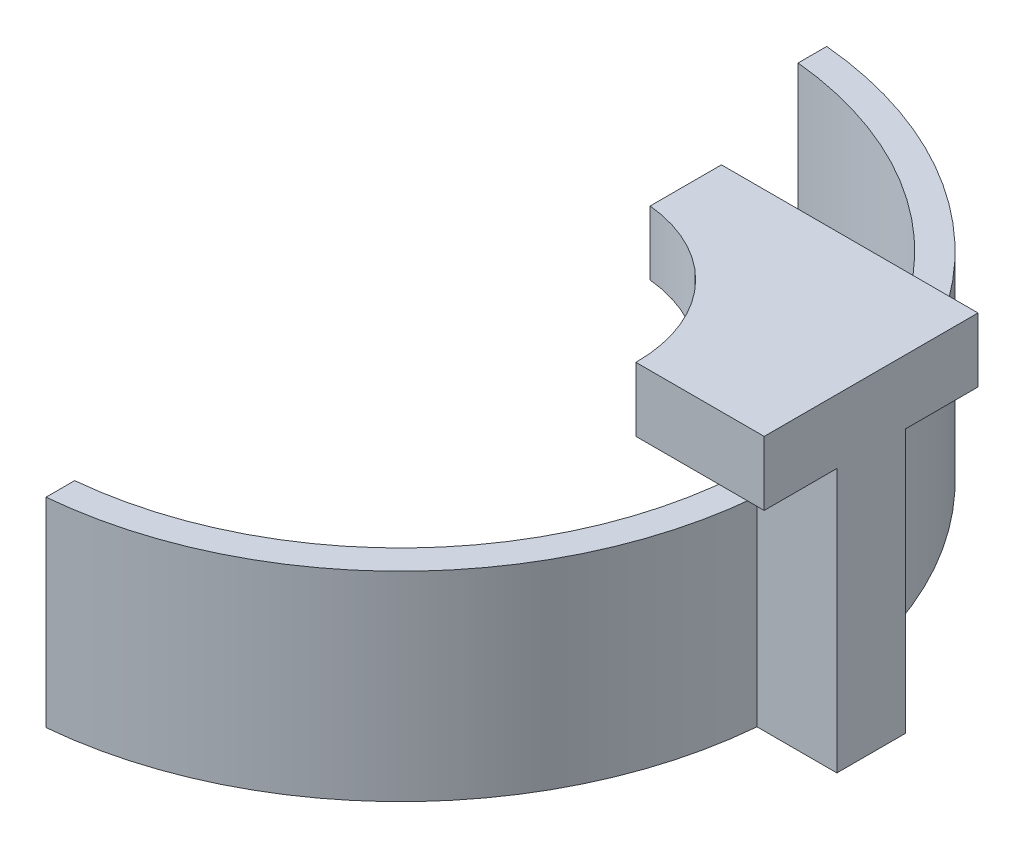
ISO-10303-21;
HEADER;
FILE_DESCRIPTION(('STEP AP214'),'2;1');
FILE_NAME('part.step','',(''),(''),'','','');
FILE_SCHEMA(('AUTOMOTIVE_DESIGN { 1 0 10303 214 1 1 1 1 }'));
ENDSEC;
DATA;
#1=APPLICATION_CONTEXT('core data for automotive mechanical design processes');
#2=APPLICATION_PROTOCOL_DEFINITION('international standard','automotive_design',2000,#1);
#3=PRODUCT_CONTEXT('',#1,'mechanical');
#4=PRODUCT('Part','Part','',(#3));
#5=PRODUCT_RELATED_PRODUCT_CATEGORY('part','',(#4));
#6=PRODUCT_DEFINITION_FORMATION('','',#4);
#7=PRODUCT_DEFINITION_CONTEXT('part definition',#1,'design');
#8=PRODUCT_DEFINITION('design','',#6,#7);
#9=PRODUCT_DEFINITION_SHAPE('','',#8);
#10=(LENGTH_UNIT() NAMED_UNIT(*) SI_UNIT(.MILLI.,.METRE.));
#11=(NAMED_UNIT(*) PLANE_ANGLE_UNIT() SI_UNIT($,.RADIAN.));
#12=(NAMED_UNIT(*) SI_UNIT($,.STERADIAN.) SOLID_ANGLE_UNIT());
#13=UNCERTAINTY_MEASURE_WITH_UNIT(LENGTH_MEASURE(1.E-05),#10,'distance_accuracy_value','');
#14=(GEOMETRIC_REPRESENTATION_CONTEXT(3) GLOBAL_UNCERTAINTY_ASSIGNED_CONTEXT((#13)) GLOBAL_UNIT_ASSIGNED_CONTEXT((#10,
#11,#12)) REPRESENTATION_CONTEXT('',''));
#15=CARTESIAN_POINT('',(0.,0.,0.));
#16=DIRECTION('',(0.,0.,1.));
#17=DIRECTION('',(1.,0.,0.));
#18=AXIS2_PLACEMENT_3D('',#15,#16,#17);
#19=CARTESIAN_POINT('',(0.,12.,0.));
#20=DIRECTION('',(0.,-1.,0.));
#21=DIRECTION('',(0.,0.,-1.));
#22=AXIS2_PLACEMENT_3D('',#19,#20,#21);
#23=CYLINDRICAL_SURFACE('',#22,27.5);
#24=DIRECTION('',(0.,-1.,0.));
#25=VECTOR('',#24,1.);
#26=CARTESIAN_POINT('',(27.3950725496393,12.,-2.4));
#27=LINE('',#26,#25);
#28=CARTESIAN_POINT('',(27.3950725496393,-2.,-2.4));
#29=VERTEX_POINT('',#28);
#30=CARTESIAN_POINT('',(27.3950725496393,12.,-2.4));
#31=VERTEX_POINT('',#30);
#32=EDGE_CURVE('E257',#29,#31,#27,.F.);
#33=ORIENTED_EDGE('',*,*,#32,.F.);
#34=CARTESIAN_POINT('',(0.,-2.,0.));
#35=DIRECTION('',(0.,1.,0.));
#36=DIRECTION('',(0.,0.,-1.));
#37=AXIS2_PLACEMENT_3D('',#34,#35,#36);
#38=CIRCLE('',#37,27.5);
#39=CARTESIAN_POINT('',(2.5,-2.,-27.3861278752583));
#40=VERTEX_POINT('',#39);
#41=EDGE_CURVE('E266',#29,#40,#38,.T.);
#42=ORIENTED_EDGE('',*,*,#41,.T.);
#43=DIRECTION('',(0.,1.,0.));
#44=VECTOR('',#43,1.);
#45=CARTESIAN_POINT('',(2.5,-2.,-27.3861278752583));
#46=LINE('',#45,#44);
#47=CARTESIAN_POINT('',(2.5,0.,-27.3861278752583));
#48=VERTEX_POINT('',#47);
#49=EDGE_CURVE('E278',#40,#48,#46,.T.);
#50=ORIENTED_EDGE('',*,*,#49,.T.);
#51=DIRECTION('',(0.,-1.,0.));
#52=VECTOR('',#51,1.);
#53=CARTESIAN_POINT('',(2.5,12.,-27.3861278752583));
#54=LINE('',#53,#52);
#55=CARTESIAN_POINT('',(2.5,12.,-27.3861278752583));
#56=VERTEX_POINT('',#55);
#57=EDGE_CURVE('E47',#56,#48,#54,.T.);
#58=ORIENTED_EDGE('',*,*,#57,.F.);
#59=CARTESIAN_POINT('',(0.,12.,0.));
#60=DIRECTION('',(0.,1.,0.));
#61=DIRECTION('',(0.,0.,1.));
#62=AXIS2_PLACEMENT_3D('',#59,#60,#61);
#63=CIRCLE('',#62,27.5);
#64=EDGE_CURVE('E308',#31,#56,#63,.T.);
#65=ORIENTED_EDGE('',*,*,#64,.F.);
#66=EDGE_LOOP('',(#33,#42,#50,#58,#65));
#67=FACE_BOUND('',#66,.T.);
#68=ADVANCED_FACE('F39',(#67),#23,.T.);
#69=DIRECTION('',(0.,-1.,0.));
#70=VECTOR('',#69,1.);
#71=CARTESIAN_POINT('',(27.3950725496393,12.,2.4));
#72=LINE('',#71,#70);
#73=CARTESIAN_POINT('',(27.3950725496393,12.,2.4));
#74=VERTEX_POINT('',#73);
#75=CARTESIAN_POINT('',(27.3950725496393,-2.,2.4));
#76=VERTEX_POINT('',#75);
#77=EDGE_CURVE('E246',#74,#76,#72,.T.);
#78=ORIENTED_EDGE('',*,*,#77,.F.);
#79=CARTESIAN_POINT('',(2.5,12.,27.3861278752583));
#80=VERTEX_POINT('',#79);
#81=EDGE_CURVE('E303',#80,#74,#63,.T.);
#82=ORIENTED_EDGE('',*,*,#81,.F.);
#83=DIRECTION('',(0.,-1.,0.));
#84=VECTOR('',#83,1.);
#85=CARTESIAN_POINT('',(2.5,12.,27.3861278752583));
#86=LINE('',#85,#84);
#87=CARTESIAN_POINT('',(2.5,0.,27.3861278752583));
#88=VERTEX_POINT('',#87);
#89=EDGE_CURVE('E317',#80,#88,#86,.T.);
#90=ORIENTED_EDGE('',*,*,#89,.T.);
#91=DIRECTION('',(0.,1.,0.));
#92=VECTOR('',#91,1.);
#93=CARTESIAN_POINT('',(2.5,-2.,27.3861278752583));
#94=LINE('',#93,#92);
#95=CARTESIAN_POINT('',(2.5,-2.,27.3861278752583));
#96=VERTEX_POINT('',#95);
#97=EDGE_CURVE('E290',#96,#88,#94,.T.);
#98=ORIENTED_EDGE('',*,*,#97,.F.);
#99=EDGE_CURVE('E261',#96,#76,#38,.T.);
#100=ORIENTED_EDGE('',*,*,#99,.T.);
#101=EDGE_LOOP('',(#78,#82,#90,#98,#100));
#102=FACE_BOUND('',#101,.T.);
#103=ADVANCED_FACE('F409',(#102),#23,.T.);
#104=CARTESIAN_POINT('',(0.,12.,0.));
#105=DIRECTION('',(0.,1.,0.));
#106=DIRECTION('',(0.,0.,1.));
#107=AXIS2_PLACEMENT_3D('',#104,#105,#106);
#108=PLANE('',#107);
#109=DIRECTION('',(0.,0.,-1.));
#110=VECTOR('',#109,1.);
#111=CARTESIAN_POINT('',(27.,12.,0.));
#112=LINE('',#111,#110);
#113=CARTESIAN_POINT('',(27.,12.,2.4));
#114=VERTEX_POINT('',#113);
#115=CARTESIAN_POINT('',(27.,12.,-2.4));
#116=VERTEX_POINT('',#115);
#117=EDGE_CURVE('E249',#114,#116,#112,.T.);
#118=ORIENTED_EDGE('',*,*,#117,.T.);
#119=DIRECTION('',(1.,0.,0.));
#120=VECTOR('',#119,1.);
#121=CARTESIAN_POINT('',(0.,12.,-2.4));
#122=LINE('',#121,#120);
#123=EDGE_CURVE('E253',#116,#31,#122,.T.);
#124=ORIENTED_EDGE('',*,*,#123,.T.);
#125=ORIENTED_EDGE('',*,*,#64,.T.);
#126=DIRECTION('',(0.,0.,1.));
#127=VECTOR('',#126,1.);
#128=CARTESIAN_POINT('',(2.5,12.,-27.3861278752583));
#129=LINE('',#128,#127);
#130=CARTESIAN_POINT('',(2.5,12.,-25.377155080899));
#131=VERTEX_POINT('',#130);
#132=EDGE_CURVE('E307',#56,#131,#129,.T.);
#133=ORIENTED_EDGE('',*,*,#132,.T.);
#134=CARTESIAN_POINT('',(0.,12.,0.));
#135=DIRECTION('',(0.,-1.,0.));
#136=DIRECTION('',(0.,0.,1.));
#137=AXIS2_PLACEMENT_3D('',#134,#135,#136);
#138=CIRCLE('',#137,25.5);
#139=CARTESIAN_POINT('',(2.5,12.,25.377155080899));
#140=VERTEX_POINT('',#139);
#141=EDGE_CURVE('E311',#131,#140,#138,.T.);
#142=ORIENTED_EDGE('',*,*,#141,.T.);
#143=DIRECTION('',(0.,0.,1.));
#144=VECTOR('',#143,1.);
#145=CARTESIAN_POINT('',(2.5,12.,25.377155080899));
#146=LINE('',#145,#144);
#147=EDGE_CURVE('E314',#140,#80,#146,.T.);
#148=ORIENTED_EDGE('',*,*,#147,.T.);
#149=ORIENTED_EDGE('',*,*,#81,.T.);
#150=DIRECTION('',(-1.,0.,0.));
#151=VECTOR('',#150,1.);
#152=CARTESIAN_POINT('',(0.,12.,2.4));
#153=LINE('',#152,#151);
#154=EDGE_CURVE('E242',#74,#114,#153,.T.);
#155=ORIENTED_EDGE('',*,*,#154,.T.);
#156=EDGE_LOOP('',(#118,#124,#125,#133,#142,#148,#149,#155));
#157=FACE_BOUND('',#156,.T.);
#158=ADVANCED_FACE('F369',(#157),#108,.T.);
#159=CARTESIAN_POINT('',(2.5,12.,-27.3861278752583));
#160=DIRECTION('',(1.,0.,0.));
#161=DIRECTION('',(0.,0.,-1.));
#162=AXIS2_PLACEMENT_3D('',#159,#160,#161);
#163=PLANE('',#162);
#164=DIRECTION('',(0.,0.,1.));
#165=VECTOR('',#164,1.);
#166=CARTESIAN_POINT('',(2.5,0.,-27.3861278752583));
#167=LINE('',#166,#165);
#168=CARTESIAN_POINT('',(2.5,0.,-25.377155080899));
#169=VERTEX_POINT('',#168);
#170=EDGE_CURVE('E293',#48,#169,#167,.T.);
#171=ORIENTED_EDGE('',*,*,#170,.T.);
#172=DIRECTION('',(0.,-1.,0.));
#173=VECTOR('',#172,1.);
#174=CARTESIAN_POINT('',(2.5,12.,-25.377155080899));
#175=LINE('',#174,#173);
#176=EDGE_CURVE('E336',#131,#169,#175,.T.);
#177=ORIENTED_EDGE('',*,*,#176,.F.);
#178=ORIENTED_EDGE('',*,*,#132,.F.);
#179=ORIENTED_EDGE('',*,*,#57,.T.);
#180=EDGE_LOOP('',(#171,#177,#178,#179));
#181=FACE_BOUND('',#180,.T.);
#182=ADVANCED_FACE('F344',(#181),#163,.F.);
#183=CARTESIAN_POINT('',(0.,12.,0.));
#184=DIRECTION('',(0.,-1.,0.));
#185=DIRECTION('',(0.,0.,-1.));
#186=AXIS2_PLACEMENT_3D('',#183,#184,#185);
#187=CYLINDRICAL_SURFACE('',#186,25.5);
#188=CARTESIAN_POINT('',(0.,0.,0.));
#189=DIRECTION('',(0.,-1.,0.));
#190=DIRECTION('',(0.,0.,1.));
#191=AXIS2_PLACEMENT_3D('',#188,#189,#190);
#192=CIRCLE('',#191,25.5);
#193=CARTESIAN_POINT('',(2.5,0.,25.377155080899));
#194=VERTEX_POINT('',#193);
#195=EDGE_CURVE('E321',#169,#194,#192,.T.);
#196=ORIENTED_EDGE('',*,*,#195,.T.);
#197=DIRECTION('',(0.,-1.,0.));
#198=VECTOR('',#197,1.);
#199=CARTESIAN_POINT('',(2.5,12.,25.377155080899));
#200=LINE('',#199,#198);
#201=EDGE_CURVE('E332',#140,#194,#200,.T.);
#202=ORIENTED_EDGE('',*,*,#201,.F.);
#203=ORIENTED_EDGE('',*,*,#141,.F.);
#204=ORIENTED_EDGE('',*,*,#176,.T.);
#205=EDGE_LOOP('',(#196,#202,#203,#204));
#206=FACE_BOUND('',#205,.T.);
#207=ADVANCED_FACE('F361',(#206),#187,.F.);
#208=CARTESIAN_POINT('',(2.5,12.,25.377155080899));
#209=DIRECTION('',(1.,0.,0.));
#210=DIRECTION('',(0.,0.,-1.));
#211=AXIS2_PLACEMENT_3D('',#208,#209,#210);
#212=PLANE('',#211);
#213=DIRECTION('',(0.,0.,1.));
#214=VECTOR('',#213,1.);
#215=CARTESIAN_POINT('',(2.5,0.,25.377155080899));
#216=LINE('',#215,#214);
#217=EDGE_CURVE('E325',#194,#88,#216,.T.);
#218=ORIENTED_EDGE('',*,*,#217,.T.);
#219=ORIENTED_EDGE('',*,*,#89,.F.);
#220=ORIENTED_EDGE('',*,*,#147,.F.);
#221=ORIENTED_EDGE('',*,*,#201,.T.);
#222=EDGE_LOOP('',(#218,#219,#220,#221));
#223=FACE_BOUND('',#222,.T.);
#224=ADVANCED_FACE('F365',(#223),#212,.F.);
#225=CARTESIAN_POINT('',(2.5,-2.,27.3861278752583));
#226=DIRECTION('',(-0.995859195463938,0.,0.0909090909090934));
#227=DIRECTION('',(0.0909090909090934,0.,0.995859195463938));
#228=AXIS2_PLACEMENT_3D('',#225,#226,#227);
#229=PLANE('',#228);
#230=DIRECTION('',(0.0909090909090934,0.,0.995859195463938));
#231=VECTOR('',#230,1.);
#232=CARTESIAN_POINT('',(2.5,0.,27.3861278752583));
#233=LINE('',#232,#231);
#234=CARTESIAN_POINT('',(1.86363636363634,0.,20.4151135070107));
#235=VERTEX_POINT('',#234);
#236=EDGE_CURVE('E286',#235,#88,#233,.T.);
#237=ORIENTED_EDGE('',*,*,#236,.F.);
#238=DIRECTION('',(0.,1.,0.));
#239=VECTOR('',#238,1.);
#240=CARTESIAN_POINT('',(1.86363636363634,-2.,20.4151135070107));
#241=LINE('',#240,#239);
#242=CARTESIAN_POINT('',(1.86363636363634,-2.,20.4151135070107));
#243=VERTEX_POINT('',#242);
#244=EDGE_CURVE('E294',#243,#235,#241,.T.);
#245=ORIENTED_EDGE('',*,*,#244,.F.);
#246=DIRECTION('',(0.0909090909090934,0.,0.995859195463938));
#247=VECTOR('',#246,1.);
#248=CARTESIAN_POINT('',(2.5,-2.,27.3861278752583));
#249=LINE('',#248,#247);
#250=EDGE_CURVE('E274',#243,#96,#249,.T.);
#251=ORIENTED_EDGE('',*,*,#250,.T.);
#252=ORIENTED_EDGE('',*,*,#97,.T.);
#253=EDGE_LOOP('',(#237,#245,#251,#252));
#254=FACE_BOUND('',#253,.T.);
#255=ADVANCED_FACE('F417',(#254),#229,.T.);
#256=CARTESIAN_POINT('',(0.,-2.,0.));
#257=DIRECTION('',(0.,1.,0.));
#258=DIRECTION('',(0.,0.,1.));
#259=AXIS2_PLACEMENT_3D('',#256,#257,#258);
#260=CYLINDRICAL_SURFACE('',#259,20.5);
#261=CARTESIAN_POINT('',(0.,0.,0.));
#262=DIRECTION('',(0.,-1.,0.));
#263=DIRECTION('',(0.,0.,-1.));
#264=AXIS2_PLACEMENT_3D('',#261,#262,#263);
#265=CIRCLE('',#264,20.5);
#266=CARTESIAN_POINT('',(1.86363636363636,0.,-20.4151135070107));
#267=VERTEX_POINT('',#266);
#268=EDGE_CURVE('E282',#267,#235,#265,.T.);
#269=ORIENTED_EDGE('',*,*,#268,.F.);
#270=DIRECTION('',(0.,1.,0.));
#271=VECTOR('',#270,1.);
#272=CARTESIAN_POINT('',(1.86363636363636,-2.,-20.4151135070107));
#273=LINE('',#272,#271);
#274=CARTESIAN_POINT('',(1.86363636363636,-2.,-20.4151135070107));
#275=VERTEX_POINT('',#274);
#276=EDGE_CURVE('E297',#275,#267,#273,.T.);
#277=ORIENTED_EDGE('',*,*,#276,.F.);
#278=CARTESIAN_POINT('',(0.,-2.,0.));
#279=DIRECTION('',(0.,-1.,0.));
#280=DIRECTION('',(0.,0.,-1.));
#281=AXIS2_PLACEMENT_3D('',#278,#279,#280);
#282=CIRCLE('',#281,20.5);
#283=EDGE_CURVE('E270',#275,#243,#282,.T.);
#284=ORIENTED_EDGE('',*,*,#283,.T.);
#285=ORIENTED_EDGE('',*,*,#244,.T.);
#286=EDGE_LOOP('',(#269,#277,#284,#285));
#287=FACE_BOUND('',#286,.T.);
#288=ADVANCED_FACE('F419',(#287),#260,.F.);
#289=CARTESIAN_POINT('',(2.5,-2.,-27.3861278752583));
#290=DIRECTION('',(-0.995859195463938,0.,-0.0909090909090919));
#291=DIRECTION('',(-0.0909090909090919,0.,0.995859195463938));
#292=AXIS2_PLACEMENT_3D('',#289,#290,#291);
#293=PLANE('',#292);
#294=DIRECTION('',(-0.0909090909090919,0.,0.995859195463938));
#295=VECTOR('',#294,1.);
#296=CARTESIAN_POINT('',(2.5,0.,-27.3861278752583));
#297=LINE('',#296,#295);
#298=EDGE_CURVE('E260',#48,#267,#297,.T.);
#299=ORIENTED_EDGE('',*,*,#298,.F.);
#300=ORIENTED_EDGE('',*,*,#49,.F.);
#301=DIRECTION('',(-0.0909090909090919,0.,0.995859195463938));
#302=VECTOR('',#301,1.);
#303=CARTESIAN_POINT('',(2.5,-2.,-27.3861278752583));
#304=LINE('',#303,#302);
#305=EDGE_CURVE('E265',#40,#275,#304,.T.);
#306=ORIENTED_EDGE('',*,*,#305,.T.);
#307=ORIENTED_EDGE('',*,*,#276,.T.);
#308=EDGE_LOOP('',(#299,#300,#306,#307));
#309=FACE_BOUND('',#308,.T.);
#310=ADVANCED_FACE('F354',(#309),#293,.T.);
#311=CARTESIAN_POINT('',(0.,-2.,0.));
#312=DIRECTION('',(0.,-1.,0.));
#313=DIRECTION('',(0.,0.,-1.));
#314=AXIS2_PLACEMENT_3D('',#311,#312,#313);
#315=PLANE('',#314);
#316=ORIENTED_EDGE('',*,*,#41,.F.);
#317=DIRECTION('',(-1.,0.,0.));
#318=VECTOR('',#317,1.);
#319=CARTESIAN_POINT('',(27.,-2.,-2.4));
#320=LINE('',#319,#318);
#321=CARTESIAN_POINT('',(33.,-2.,-2.4));
#322=VERTEX_POINT('',#321);
#323=EDGE_CURVE('E225',#322,#29,#320,.T.);
#324=ORIENTED_EDGE('',*,*,#323,.F.);
#325=DIRECTION('',(0.,0.,-1.));
#326=VECTOR('',#325,1.);
#327=CARTESIAN_POINT('',(33.,-2.,-2.4));
#328=LINE('',#327,#326);
#329=CARTESIAN_POINT('',(33.,-2.,2.4));
#330=VERTEX_POINT('',#329);
#331=EDGE_CURVE('E221',#330,#322,#328,.T.);
#332=ORIENTED_EDGE('',*,*,#331,.F.);
#333=DIRECTION('',(1.,0.,0.));
#334=VECTOR('',#333,1.);
#335=CARTESIAN_POINT('',(27.,-2.,2.4));
#336=LINE('',#335,#334);
#337=EDGE_CURVE('E228',#76,#330,#336,.T.);
#338=ORIENTED_EDGE('',*,*,#337,.F.);
#339=ORIENTED_EDGE('',*,*,#99,.F.);
#340=ORIENTED_EDGE('',*,*,#250,.F.);
#341=ORIENTED_EDGE('',*,*,#283,.F.);
#342=ORIENTED_EDGE('',*,*,#305,.F.);
#343=EDGE_LOOP('',(#316,#324,#332,#338,#339,#340,#341,#342));
#344=FACE_BOUND('',#343,.T.);
#345=ADVANCED_FACE('F413',(#344),#315,.T.);
#346=CARTESIAN_POINT('',(0.,0.,0.));
#347=DIRECTION('',(0.,-1.,0.));
#348=DIRECTION('',(0.,0.,-1.));
#349=AXIS2_PLACEMENT_3D('',#346,#347,#348);
#350=PLANE('',#349);
#351=ORIENTED_EDGE('',*,*,#217,.F.);
#352=ORIENTED_EDGE('',*,*,#195,.F.);
#353=ORIENTED_EDGE('',*,*,#170,.F.);
#354=ORIENTED_EDGE('',*,*,#298,.T.);
#355=ORIENTED_EDGE('',*,*,#268,.T.);
#356=ORIENTED_EDGE('',*,*,#236,.T.);
#357=EDGE_LOOP('',(#351,#352,#353,#354,#355,#356));
#358=FACE_BOUND('',#357,.T.);
#359=ADVANCED_FACE('F357',(#358),#350,.F.);
#360=CARTESIAN_POINT('',(27.,18.,-2.4));
#361=DIRECTION('',(0.,0.,1.));
#362=DIRECTION('',(1.,0.,0.));
#363=AXIS2_PLACEMENT_3D('',#360,#361,#362);
#364=PLANE('',#363);
#365=DIRECTION('',(0.,-1.,0.));
#366=VECTOR('',#365,1.);
#367=CARTESIAN_POINT('',(27.,18.,-2.4));
#368=LINE('',#367,#366);
#369=CARTESIAN_POINT('',(27.,16.5,-2.4));
#370=VERTEX_POINT('',#369);
#371=EDGE_CURVE('E236',#370,#116,#368,.T.);
#372=ORIENTED_EDGE('',*,*,#371,.F.);
#373=DIRECTION('',(1.,0.,0.));
#374=VECTOR('',#373,1.);
#375=CARTESIAN_POINT('',(27.,16.5,-2.4));
#376=LINE('',#375,#374);
#377=CARTESIAN_POINT('',(33.,16.5,-2.4));
#378=VERTEX_POINT('',#377);
#379=EDGE_CURVE('E218',#370,#378,#376,.T.);
#380=ORIENTED_EDGE('',*,*,#379,.T.);
#381=DIRECTION('',(0.,-1.,0.));
#382=VECTOR('',#381,1.);
#383=CARTESIAN_POINT('',(33.,18.,-2.4));
#384=LINE('',#383,#382);
#385=EDGE_CURVE('E239',#378,#322,#384,.T.);
#386=ORIENTED_EDGE('',*,*,#385,.T.);
#387=ORIENTED_EDGE('',*,*,#323,.T.);
#388=ORIENTED_EDGE('',*,*,#32,.T.);
#389=ORIENTED_EDGE('',*,*,#123,.F.);
#390=EDGE_LOOP('',(#372,#380,#386,#387,#388,#389));
#391=FACE_BOUND('',#390,.T.);
#392=ADVANCED_FACE('F422',(#391),#364,.F.);
#393=CARTESIAN_POINT('',(27.,18.,2.4));
#394=DIRECTION('',(0.,0.,-1.));
#395=DIRECTION('',(-1.,0.,0.));
#396=AXIS2_PLACEMENT_3D('',#393,#394,#395);
#397=PLANE('',#396);
#398=DIRECTION('',(0.,-1.,0.));
#399=VECTOR('',#398,1.);
#400=CARTESIAN_POINT('',(33.,18.,2.4));
#401=LINE('',#400,#399);
#402=CARTESIAN_POINT('',(33.,16.5,2.4));
#403=VERTEX_POINT('',#402);
#404=EDGE_CURVE('E62',#403,#330,#401,.T.);
#405=ORIENTED_EDGE('',*,*,#404,.F.);
#406=DIRECTION('',(-1.,0.,0.));
#407=VECTOR('',#406,1.);
#408=CARTESIAN_POINT('',(27.,16.5,2.4));
#409=LINE('',#408,#407);
#410=CARTESIAN_POINT('',(27.,16.5,2.4));
#411=VERTEX_POINT('',#410);
#412=EDGE_CURVE('E209',#403,#411,#409,.T.);
#413=ORIENTED_EDGE('',*,*,#412,.T.);
#414=DIRECTION('',(0.,-1.,0.));
#415=VECTOR('',#414,1.);
#416=CARTESIAN_POINT('',(27.,18.,2.4));
#417=LINE('',#416,#415);
#418=EDGE_CURVE('E233',#411,#114,#417,.T.);
#419=ORIENTED_EDGE('',*,*,#418,.T.);
#420=ORIENTED_EDGE('',*,*,#154,.F.);
#421=ORIENTED_EDGE('',*,*,#77,.T.);
#422=ORIENTED_EDGE('',*,*,#337,.T.);
#423=EDGE_LOOP('',(#405,#413,#419,#420,#421,#422));
#424=FACE_BOUND('',#423,.T.);
#425=ADVANCED_FACE('F401',(#424),#397,.F.);
#426=CARTESIAN_POINT('',(33.,18.,-2.4));
#427=DIRECTION('',(-1.,0.,0.));
#428=DIRECTION('',(0.,0.,1.));
#429=AXIS2_PLACEMENT_3D('',#426,#427,#428);
#430=PLANE('',#429);
#431=ORIENTED_EDGE('',*,*,#385,.F.);
#432=DIRECTION('',(0.,0.,-1.));
#433=VECTOR('',#432,1.);
#434=CARTESIAN_POINT('',(33.,16.5,-7.5));
#435=LINE('',#434,#433);
#436=CARTESIAN_POINT('',(33.,16.5,-7.5));
#437=VERTEX_POINT('',#436);
#438=EDGE_CURVE('E189',#378,#437,#435,.T.);
#439=ORIENTED_EDGE('',*,*,#438,.T.);
#440=DIRECTION('',(0.,1.,0.));
#441=VECTOR('',#440,1.);
#442=CARTESIAN_POINT('',(33.,16.5,-7.5));
#443=LINE('',#442,#441);
#444=CARTESIAN_POINT('',(33.,21.,-7.5));
#445=VERTEX_POINT('',#444);
#446=EDGE_CURVE('E210',#437,#445,#443,.T.);
#447=ORIENTED_EDGE('',*,*,#446,.T.);
#448=DIRECTION('',(0.,0.,-1.));
#449=VECTOR('',#448,1.);
#450=CARTESIAN_POINT('',(33.,21.,-7.5));
#451=LINE('',#450,#449);
#452=CARTESIAN_POINT('',(33.,21.,7.5));
#453=VERTEX_POINT('',#452);
#454=EDGE_CURVE('E191',#453,#445,#451,.T.);
#455=ORIENTED_EDGE('',*,*,#454,.F.);
#456=DIRECTION('',(0.,1.,0.));
#457=VECTOR('',#456,1.);
#458=CARTESIAN_POINT('',(33.,16.5,7.5));
#459=LINE('',#458,#457);
#460=CARTESIAN_POINT('',(33.,16.5,7.5));
#461=VERTEX_POINT('',#460);
#462=EDGE_CURVE('E205',#461,#453,#459,.T.);
#463=ORIENTED_EDGE('',*,*,#462,.F.);
#464=EDGE_CURVE('E195',#461,#403,#435,.T.);
#465=ORIENTED_EDGE('',*,*,#464,.T.);
#466=ORIENTED_EDGE('',*,*,#404,.T.);
#467=ORIENTED_EDGE('',*,*,#331,.T.);
#468=EDGE_LOOP('',(#431,#439,#447,#455,#463,#465,#466,#467));
#469=FACE_BOUND('',#468,.T.);
#470=ADVANCED_FACE('F378',(#469),#430,.F.);
#471=CARTESIAN_POINT('',(27.,18.,-2.4));
#472=DIRECTION('',(1.,0.,0.));
#473=DIRECTION('',(0.,0.,-1.));
#474=AXIS2_PLACEMENT_3D('',#471,#472,#473);
#475=PLANE('',#474);
#476=ORIENTED_EDGE('',*,*,#418,.F.);
#477=DIRECTION('',(0.,0.,-1.));
#478=VECTOR('',#477,1.);
#479=CARTESIAN_POINT('',(27.,16.5,-2.4));
#480=LINE('',#479,#478);
#481=EDGE_CURVE('E11',#411,#370,#480,.T.);
#482=ORIENTED_EDGE('',*,*,#481,.T.);
#483=ORIENTED_EDGE('',*,*,#371,.T.);
#484=ORIENTED_EDGE('',*,*,#117,.F.);
#485=EDGE_LOOP('',(#476,#482,#483,#484));
#486=FACE_BOUND('',#485,.T.);
#487=ADVANCED_FACE('F404',(#486),#475,.F.);
#488=CARTESIAN_POINT('',(0.,16.5,0.));
#489=DIRECTION('',(0.,-1.,0.));
#490=DIRECTION('',(0.,0.,-1.));
#491=AXIS2_PLACEMENT_3D('',#488,#489,#490);
#492=PLANE('',#491);
#493=CARTESIAN_POINT('',(14.0001255664761,16.5,7.44988699017155));
#494=DIRECTION('',(0.,-1.,0.));
#495=DIRECTION('',(0.,0.,-1.));
#496=AXIS2_PLACEMENT_3D('',#493,#494,#495);
#497=CIRCLE('',#496,10.);
#498=CARTESIAN_POINT('',(15.,16.5,-2.5));
#499=VERTEX_POINT('',#498);
#500=CARTESIAN_POINT('',(24.,16.5,7.5));
#501=VERTEX_POINT('',#500);
#502=EDGE_CURVE('E387',#499,#501,#497,.T.);
#503=ORIENTED_EDGE('',*,*,#502,.F.);
#504=DIRECTION('',(0.,0.,1.));
#505=VECTOR('',#504,1.);
#506=CARTESIAN_POINT('',(15.,16.5,-7.5));
#507=LINE('',#506,#505);
#508=CARTESIAN_POINT('',(15.,16.5,-7.5));
#509=VERTEX_POINT('',#508);
#510=EDGE_CURVE('E176',#509,#499,#507,.T.);
#511=ORIENTED_EDGE('',*,*,#510,.F.);
#512=DIRECTION('',(-1.,0.,0.));
#513=VECTOR('',#512,1.);
#514=CARTESIAN_POINT('',(33.,16.5,-7.5));
#515=LINE('',#514,#513);
#516=EDGE_CURVE('E199',#437,#509,#515,.T.);
#517=ORIENTED_EDGE('',*,*,#516,.F.);
#518=ORIENTED_EDGE('',*,*,#438,.F.);
#519=ORIENTED_EDGE('',*,*,#379,.F.);
#520=ORIENTED_EDGE('',*,*,#481,.F.);
#521=ORIENTED_EDGE('',*,*,#412,.F.);
#522=ORIENTED_EDGE('',*,*,#464,.F.);
#523=DIRECTION('',(1.,0.,0.));
#524=VECTOR('',#523,1.);
#525=CARTESIAN_POINT('',(15.,16.5,7.5));
#526=LINE('',#525,#524);
#527=EDGE_CURVE('E185',#501,#461,#526,.T.);
#528=ORIENTED_EDGE('',*,*,#527,.F.);
#529=EDGE_LOOP('',(#503,#511,#517,#518,#519,#520,#521,#522,#528));
#530=FACE_BOUND('',#529,.T.);
#531=ADVANCED_FACE('F385',(#530),#492,.T.);
#532=CARTESIAN_POINT('',(15.,16.5,7.5));
#533=DIRECTION('',(0.,0.,1.));
#534=DIRECTION('',(1.,0.,0.));
#535=AXIS2_PLACEMENT_3D('',#532,#533,#534);
#536=PLANE('',#535);
#537=DIRECTION('',(0.,1.,0.));
#538=VECTOR('',#537,1.);
#539=CARTESIAN_POINT('',(24.,16.,7.5));
#540=LINE('',#539,#538);
#541=CARTESIAN_POINT('',(24.,21.,7.5));
#542=VERTEX_POINT('',#541);
#543=EDGE_CURVE('E54',#501,#542,#540,.T.);
#544=ORIENTED_EDGE('',*,*,#543,.F.);
#545=ORIENTED_EDGE('',*,*,#527,.T.);
#546=ORIENTED_EDGE('',*,*,#462,.T.);
#547=DIRECTION('',(1.,0.,0.));
#548=VECTOR('',#547,1.);
#549=CARTESIAN_POINT('',(15.,21.,7.5));
#550=LINE('',#549,#548);
#551=EDGE_CURVE('E390',#542,#453,#550,.T.);
#552=ORIENTED_EDGE('',*,*,#551,.F.);
#553=EDGE_LOOP('',(#544,#545,#546,#552));
#554=FACE_BOUND('',#553,.T.);
#555=ADVANCED_FACE('F553',(#554),#536,.T.);
#556=CARTESIAN_POINT('',(15.,16.5,-7.5));
#557=DIRECTION('',(-1.,0.,0.));
#558=DIRECTION('',(0.,0.,1.));
#559=AXIS2_PLACEMENT_3D('',#556,#557,#558);
#560=PLANE('',#559);
#561=DIRECTION('',(0.,1.,0.));
#562=VECTOR('',#561,1.);
#563=CARTESIAN_POINT('',(15.,16.,-2.5));
#564=LINE('',#563,#562);
#565=CARTESIAN_POINT('',(15.,21.,-2.5));
#566=VERTEX_POINT('',#565);
#567=EDGE_CURVE('E163',#499,#566,#564,.T.);
#568=ORIENTED_EDGE('',*,*,#567,.T.);
#569=DIRECTION('',(0.,0.,1.));
#570=VECTOR('',#569,1.);
#571=CARTESIAN_POINT('',(15.,21.,-7.5));
#572=LINE('',#571,#570);
#573=CARTESIAN_POINT('',(15.,21.,-7.5));
#574=VERTEX_POINT('',#573);
#575=EDGE_CURVE('E174',#574,#566,#572,.T.);
#576=ORIENTED_EDGE('',*,*,#575,.F.);
#577=DIRECTION('',(0.,1.,0.));
#578=VECTOR('',#577,1.);
#579=CARTESIAN_POINT('',(15.,16.5,-7.5));
#580=LINE('',#579,#578);
#581=EDGE_CURVE('E206',#509,#574,#580,.T.);
#582=ORIENTED_EDGE('',*,*,#581,.F.);
#583=ORIENTED_EDGE('',*,*,#510,.T.);
#584=EDGE_LOOP('',(#568,#576,#582,#583));
#585=FACE_BOUND('',#584,.T.);
#586=ADVANCED_FACE('F173',(#585),#560,.T.);
#587=CARTESIAN_POINT('',(33.,16.5,-7.5));
#588=DIRECTION('',(0.,0.,-1.));
#589=DIRECTION('',(-1.,0.,0.));
#590=AXIS2_PLACEMENT_3D('',#587,#588,#589);
#591=PLANE('',#590);
#592=ORIENTED_EDGE('',*,*,#581,.T.);
#593=DIRECTION('',(-1.,0.,0.));
#594=VECTOR('',#593,1.);
#595=CARTESIAN_POINT('',(33.,21.,-7.5));
#596=LINE('',#595,#594);
#597=EDGE_CURVE('E183',#445,#574,#596,.T.);
#598=ORIENTED_EDGE('',*,*,#597,.F.);
#599=ORIENTED_EDGE('',*,*,#446,.F.);
#600=ORIENTED_EDGE('',*,*,#516,.T.);
#601=EDGE_LOOP('',(#592,#598,#599,#600));
#602=FACE_BOUND('',#601,.T.);
#603=ADVANCED_FACE('F384',(#602),#591,.T.);
#604=CARTESIAN_POINT('',(0.,21.,0.));
#605=DIRECTION('',(0.,-1.,0.));
#606=DIRECTION('',(0.,0.,-1.));
#607=AXIS2_PLACEMENT_3D('',#604,#605,#606);
#608=PLANE('',#607);
#609=ORIENTED_EDGE('',*,*,#575,.T.);
#610=CARTESIAN_POINT('',(14.0001255664761,21.,7.44988699017155));
#611=DIRECTION('',(0.,1.,0.));
#612=DIRECTION('',(0.,0.,1.));
#613=AXIS2_PLACEMENT_3D('',#610,#611,#612);
#614=CIRCLE('',#613,10.);
#615=EDGE_CURVE('E160',#542,#566,#614,.T.);
#616=ORIENTED_EDGE('',*,*,#615,.F.);
#617=ORIENTED_EDGE('',*,*,#551,.T.);
#618=ORIENTED_EDGE('',*,*,#454,.T.);
#619=ORIENTED_EDGE('',*,*,#597,.T.);
#620=EDGE_LOOP('',(#609,#616,#617,#618,#619));
#621=FACE_BOUND('',#620,.T.);
#622=ADVANCED_FACE('F180',(#621),#608,.F.);
#623=CARTESIAN_POINT('',(14.0001255664761,16.,7.44988699017155));
#624=DIRECTION('',(0.,1.,0.));
#625=DIRECTION('',(0.,0.,1.));
#626=AXIS2_PLACEMENT_3D('',#623,#624,#625);
#627=CYLINDRICAL_SURFACE('',#626,10.);
#628=ORIENTED_EDGE('',*,*,#502,.T.);
#629=ORIENTED_EDGE('',*,*,#543,.T.);
#630=ORIENTED_EDGE('',*,*,#615,.T.);
#631=ORIENTED_EDGE('',*,*,#567,.F.);
#632=EDGE_LOOP('',(#628,#629,#630,#631));
#633=FACE_BOUND('',#632,.T.);
#634=ADVANCED_FACE('F162',(#633),#627,.F.);
#635=CLOSED_SHELL('',(#68,#103,#158,#182,#207,#224,#255,#288,#310,#345,#359,#392,#425,#470,#487,
#531,#555,#586,#603,#622,#634));
#636=MANIFOLD_SOLID_BREP('B2',#635);
#637=ADVANCED_BREP_SHAPE_REPRESENTATION('',(#18,#636),#14);
#638=SHAPE_DEFINITION_REPRESENTATION(#9,#637);
ENDSEC;
END-ISO-10303-21;
